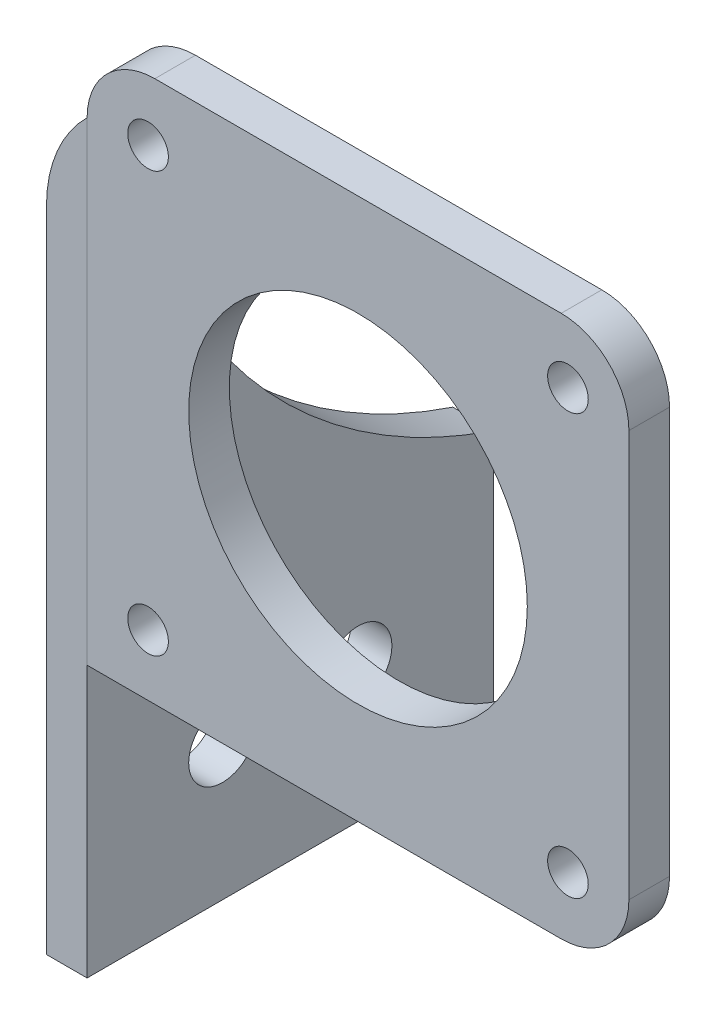
ISO-10303-21;
HEADER;
FILE_DESCRIPTION(('STEP AP214'),'2;1');
FILE_NAME('part.step','',(''),(''),'','','');
FILE_SCHEMA(('AUTOMOTIVE_DESIGN { 1 0 10303 214 1 1 1 1 }'));
ENDSEC;
DATA;
#1=APPLICATION_CONTEXT('core data for automotive mechanical design processes');
#2=APPLICATION_PROTOCOL_DEFINITION('international standard','automotive_design',2000,#1);
#3=PRODUCT_CONTEXT('',#1,'mechanical');
#4=PRODUCT('Part','Part','',(#3));
#5=PRODUCT_RELATED_PRODUCT_CATEGORY('part','',(#4));
#6=PRODUCT_DEFINITION_FORMATION('','',#4);
#7=PRODUCT_DEFINITION_CONTEXT('part definition',#1,'design');
#8=PRODUCT_DEFINITION('design','',#6,#7);
#9=PRODUCT_DEFINITION_SHAPE('','',#8);
#10=(LENGTH_UNIT() NAMED_UNIT(*) SI_UNIT(.MILLI.,.METRE.));
#11=(NAMED_UNIT(*) PLANE_ANGLE_UNIT() SI_UNIT($,.RADIAN.));
#12=(NAMED_UNIT(*) SI_UNIT($,.STERADIAN.) SOLID_ANGLE_UNIT());
#13=UNCERTAINTY_MEASURE_WITH_UNIT(LENGTH_MEASURE(1.E-05),#10,'distance_accuracy_value','');
#14=(GEOMETRIC_REPRESENTATION_CONTEXT(3) GLOBAL_UNCERTAINTY_ASSIGNED_CONTEXT((#13)) GLOBAL_UNIT_ASSIGNED_CONTEXT((#10,
#11,#12)) REPRESENTATION_CONTEXT('',''));
#15=CARTESIAN_POINT('',(0.,0.,0.));
#16=DIRECTION('',(0.,0.,1.));
#17=DIRECTION('',(1.,0.,0.));
#18=AXIS2_PLACEMENT_3D('',#15,#16,#17);
#19=CARTESIAN_POINT('',(-23.,17.5825832864055,-39.5329783342293));
#20=DIRECTION('',(1.,0.,0.));
#21=DIRECTION('',(0.,0.,-1.));
#22=AXIS2_PLACEMENT_3D('',#19,#20,#21);
#23=PLANE('',#22);
#24=DIRECTION('',(0.,1.,0.));
#25=VECTOR('',#24,1.);
#26=CARTESIAN_POINT('',(-23.,-40.,3.));
#27=LINE('',#26,#25);
#28=CARTESIAN_POINT('',(-23.,-40.,3.));
#29=VERTEX_POINT('',#28);
#30=CARTESIAN_POINT('',(-23.,7.85857157145712,3.));
#31=VERTEX_POINT('',#30);
#32=EDGE_CURVE('E108',#29,#31,#27,.T.);
#33=ORIENTED_EDGE('',*,*,#32,.T.);
#34=DIRECTION('',(0.,0.,1.));
#35=VECTOR('',#34,1.);
#36=CARTESIAN_POINT('',(-23.,7.85857157145712,-39.5329783342293));
#37=LINE('',#36,#35);
#38=CARTESIAN_POINT('',(-23.,7.85857157145712,-1.12764395769495));
#39=VERTEX_POINT('',#38);
#40=EDGE_CURVE('E106',#31,#39,#37,.F.);
#41=ORIENTED_EDGE('',*,*,#40,.T.);
#42=CARTESIAN_POINT('',(-23.,17.5825832864055,-39.5329783342293));
#43=DIRECTION('',(1.,0.,0.));
#44=DIRECTION('',(0.,0.,-1.));
#45=AXIS2_PLACEMENT_3D('',#42,#43,#44);
#46=CIRCLE('',#45,39.6172451390283);
#47=CARTESIAN_POINT('',(-23.,-20.,-27.));
#48=VERTEX_POINT('',#47);
#49=EDGE_CURVE('E100',#39,#48,#46,.T.);
#50=ORIENTED_EDGE('',*,*,#49,.T.);
#51=DIRECTION('',(0.,-1.,0.));
#52=VECTOR('',#51,1.);
#53=CARTESIAN_POINT('',(-23.,-40.,-27.));
#54=LINE('',#53,#52);
#55=CARTESIAN_POINT('',(-23.,-40.,-27.));
#56=VERTEX_POINT('',#55);
#57=EDGE_CURVE('E104',#48,#56,#54,.T.);
#58=ORIENTED_EDGE('',*,*,#57,.T.);
#59=DIRECTION('',(0.,0.,1.));
#60=VECTOR('',#59,1.);
#61=CARTESIAN_POINT('',(-23.,-40.,3.));
#62=LINE('',#61,#60);
#63=EDGE_CURVE('E122',#56,#29,#62,.T.);
#64=ORIENTED_EDGE('',*,*,#63,.T.);
#65=EDGE_LOOP('',(#33,#41,#50,#58,#64));
#66=FACE_BOUND('',#65,.T.);
#67=CARTESIAN_POINT('',(-23.,-30.,-17.));
#68=DIRECTION('',(-1.,0.,0.));
#69=DIRECTION('',(0.,0.,1.));
#70=AXIS2_PLACEMENT_3D('',#67,#68,#69);
#71=CIRCLE('',#70,2.5);
#72=CARTESIAN_POINT('',(-23.,-30.,-14.5));
#73=VERTEX_POINT('',#72);
#74=EDGE_CURVE('E131',#73,#73,#71,.T.);
#75=ORIENTED_EDGE('',*,*,#74,.F.);
#76=EDGE_LOOP('',(#75));
#77=FACE_BOUND('',#76,.T.);
#78=CARTESIAN_POINT('',(-23.,-30.,-6.99999999999999));
#79=DIRECTION('',(-1.,0.,0.));
#80=DIRECTION('',(0.,0.,1.));
#81=AXIS2_PLACEMENT_3D('',#78,#79,#80);
#82=CIRCLE('',#81,2.5);
#83=CARTESIAN_POINT('',(-23.,-30.,-4.49999999999999));
#84=VERTEX_POINT('',#83);
#85=EDGE_CURVE('E189',#84,#84,#82,.T.);
#86=ORIENTED_EDGE('',*,*,#85,.F.);
#87=EDGE_LOOP('',(#86));
#88=FACE_BOUND('',#87,.T.);
#89=ADVANCED_FACE('F53',(#66,#77,#88),#23,.F.);
#90=CARTESIAN_POINT('',(-20.,17.5825832864055,-39.5329783342293));
#91=DIRECTION('',(1.,0.,0.));
#92=DIRECTION('',(0.,0.,-1.));
#93=AXIS2_PLACEMENT_3D('',#90,#91,#92);
#94=PLANE('',#93);
#95=CARTESIAN_POINT('',(-20.,-30.,-17.));
#96=DIRECTION('',(-1.,0.,0.));
#97=DIRECTION('',(0.,0.,1.));
#98=AXIS2_PLACEMENT_3D('',#95,#96,#97);
#99=CIRCLE('',#98,2.5);
#100=CARTESIAN_POINT('',(-20.,-30.,-14.5));
#101=VERTEX_POINT('',#100);
#102=EDGE_CURVE('E194',#101,#101,#99,.T.);
#103=ORIENTED_EDGE('',*,*,#102,.T.);
#104=EDGE_LOOP('',(#103));
#105=FACE_BOUND('',#104,.T.);
#106=DIRECTION('',(0.,1.,0.));
#107=VECTOR('',#106,1.);
#108=CARTESIAN_POINT('',(-20.,-40.,3.));
#109=LINE('',#108,#107);
#110=CARTESIAN_POINT('',(-20.,-40.,3.));
#111=VERTEX_POINT('',#110);
#112=CARTESIAN_POINT('',(-20.,15.,3.));
#113=VERTEX_POINT('',#112);
#114=EDGE_CURVE('E128',#111,#113,#109,.T.);
#115=ORIENTED_EDGE('',*,*,#114,.F.);
#116=DIRECTION('',(0.,0.,1.));
#117=VECTOR('',#116,1.);
#118=CARTESIAN_POINT('',(-20.,-40.,3.));
#119=LINE('',#118,#117);
#120=CARTESIAN_POINT('',(-20.,-40.,-27.));
#121=VERTEX_POINT('',#120);
#122=EDGE_CURVE('E136',#121,#111,#119,.T.);
#123=ORIENTED_EDGE('',*,*,#122,.F.);
#124=DIRECTION('',(0.,-1.,0.));
#125=VECTOR('',#124,1.);
#126=CARTESIAN_POINT('',(-20.,-40.,-27.));
#127=LINE('',#126,#125);
#128=CARTESIAN_POINT('',(-20.,-20.,-27.));
#129=VERTEX_POINT('',#128);
#130=EDGE_CURVE('E134',#129,#121,#127,.T.);
#131=ORIENTED_EDGE('',*,*,#130,.F.);
#132=CARTESIAN_POINT('',(-20.,17.5825832864055,-39.5329783342293));
#133=DIRECTION('',(1.,0.,0.));
#134=DIRECTION('',(0.,0.,-1.));
#135=AXIS2_PLACEMENT_3D('',#132,#133,#134);
#136=CIRCLE('',#135,39.6172451390283);
#137=CARTESIAN_POINT('',(-20.,15.,0.));
#138=VERTEX_POINT('',#137);
#139=EDGE_CURVE('E114',#138,#129,#136,.T.);
#140=ORIENTED_EDGE('',*,*,#139,.F.);
#141=DIRECTION('',(0.,0.,-1.));
#142=VECTOR('',#141,1.);
#143=CARTESIAN_POINT('',(-20.,15.,3.));
#144=LINE('',#143,#142);
#145=EDGE_CURVE('E130',#113,#138,#144,.T.);
#146=ORIENTED_EDGE('',*,*,#145,.F.);
#147=EDGE_LOOP('',(#115,#123,#131,#140,#146));
#148=FACE_BOUND('',#147,.T.);
#149=CARTESIAN_POINT('',(-20.,-30.,-6.99999999999999));
#150=DIRECTION('',(-1.,0.,0.));
#151=DIRECTION('',(0.,0.,1.));
#152=AXIS2_PLACEMENT_3D('',#149,#150,#151);
#153=CIRCLE('',#152,2.5);
#154=CARTESIAN_POINT('',(-20.,-30.,-4.49999999999999));
#155=VERTEX_POINT('',#154);
#156=EDGE_CURVE('E192',#155,#155,#153,.T.);
#157=ORIENTED_EDGE('',*,*,#156,.T.);
#158=EDGE_LOOP('',(#157));
#159=FACE_BOUND('',#158,.T.);
#160=ADVANCED_FACE('F152',(#105,#148,#159),#94,.T.);
#161=CARTESIAN_POINT('',(-23.,-40.,3.));
#162=DIRECTION('',(0.,0.,-1.));
#163=DIRECTION('',(0.,1.,0.));
#164=AXIS2_PLACEMENT_3D('',#161,#162,#163);
#165=PLANE('',#164);
#166=ORIENTED_EDGE('',*,*,#114,.T.);
#167=CARTESIAN_POINT('',(-13.,7.85857157145712,3.));
#168=DIRECTION('',(0.,0.,-1.));
#169=DIRECTION('',(0.,1.,0.));
#170=AXIS2_PLACEMENT_3D('',#167,#168,#169);
#171=CIRCLE('',#170,10.);
#172=EDGE_CURVE('E12',#113,#31,#171,.F.);
#173=ORIENTED_EDGE('',*,*,#172,.T.);
#174=ORIENTED_EDGE('',*,*,#32,.F.);
#175=DIRECTION('',(1.,0.,0.));
#176=VECTOR('',#175,1.);
#177=CARTESIAN_POINT('',(-23.,-40.,3.));
#178=LINE('',#177,#176);
#179=EDGE_CURVE('E124',#29,#111,#178,.T.);
#180=ORIENTED_EDGE('',*,*,#179,.T.);
#181=EDGE_LOOP('',(#166,#173,#174,#180));
#182=FACE_BOUND('',#181,.T.);
#183=ADVANCED_FACE('F149',(#182),#165,.F.);
#184=CARTESIAN_POINT('',(-23.,17.5825832864055,-39.5329783342293));
#185=DIRECTION('',(1.,0.,0.));
#186=DIRECTION('',(0.,0.,-1.));
#187=AXIS2_PLACEMENT_3D('',#184,#185,#186);
#188=CYLINDRICAL_SURFACE('',#187,39.6172451390283);
#189=ORIENTED_EDGE('',*,*,#49,.F.);
#190=CARTESIAN_POINT('',(-23.,7.85857157145712,-1.12764395769495));
#191=CARTESIAN_POINT('',(-23.0000319209758,8.12974956813189,-1.05895427773539));
#192=CARTESIAN_POINT('',(-22.9889700171909,8.40169050032335,-0.993184804813319));
#193=CARTESIAN_POINT('',(-22.9445171590816,8.94520383395614,-0.867761509036204));
#194=CARTESIAN_POINT('',(-22.9111223388912,9.21677616343493,-0.808108747056511));
#195=CARTESIAN_POINT('',(-22.8218310980394,9.7577507066422,-0.695178834425145));
#196=CARTESIAN_POINT('',(-22.7659190428252,10.0271512795944,-0.641906147108968));
#197=CARTESIAN_POINT('',(-22.6317134091241,10.5615270693367,-0.541893125100899));
#198=CARTESIAN_POINT('',(-22.5534222065767,10.8265027527474,-0.495152097742489));
#199=CARTESIAN_POINT('',(-22.3746189301337,11.3504591926651,-0.408083338343636));
#200=CARTESIAN_POINT('',(-22.2740686600344,11.6094287885512,-0.367766837724825));
#201=CARTESIAN_POINT('',(-22.0513707296473,12.1188485546675,-0.293457738989226));
#202=CARTESIAN_POINT('',(-21.9292233051454,12.3692988178716,-0.259465071840601));
#203=CARTESIAN_POINT('',(-21.6643278968498,12.8592562248348,-0.197534085010089));
#204=CARTESIAN_POINT('',(-21.5216166224987,13.0987818881343,-0.169585194064152));
#205=CARTESIAN_POINT('',(-21.2164450536759,13.5653832857669,-0.11923377029903));
#206=CARTESIAN_POINT('',(-21.0539935658788,13.7924645067915,-0.0968287776351461));
#207=CARTESIAN_POINT('',(-20.7463366651438,14.1865283866731,-0.0611721575644502));
#208=CARTESIAN_POINT('',(-20.6046131819379,14.356159162547,-0.0469861095867625));
#209=CARTESIAN_POINT('',(-20.3103147016795,14.6855825169659,-0.0214508691222647));
#210=CARTESIAN_POINT('',(-20.1577531941874,14.845386879104,-0.0100982268334988));
#211=CARTESIAN_POINT('',(-20.,15.,0.));
#212=B_SPLINE_CURVE_WITH_KNOTS('',3,(#190,#191,#192,#193,#194,#195,#196,#197,#198,#199,#200,
#201,#202,#203,#204,#205,#206,#207,#208,#209,#210,#211),.UNSPECIFIED.,.F.,.F.,(4,2,2,2,2,2,2,2,
2,2,4),(0.,0.83902559096287,1.67819645629674,2.51795099648467,3.3576164150717,4.19873401163109,
5.03984242589621,5.87946752602923,6.71871941118413,7.38272818475243,8.04592450920289),.UNSPECIFIED.);
#213=EDGE_CURVE('E62',#39,#138,#212,.T.);
#214=ORIENTED_EDGE('',*,*,#213,.T.);
#215=ORIENTED_EDGE('',*,*,#139,.T.);
#216=DIRECTION('',(1.,0.,0.));
#217=VECTOR('',#216,1.);
#218=CARTESIAN_POINT('',(-23.,-20.,-27.));
#219=LINE('',#218,#217);
#220=EDGE_CURVE('E111',#48,#129,#219,.T.);
#221=ORIENTED_EDGE('',*,*,#220,.F.);
#222=EDGE_LOOP('',(#189,#214,#215,#221));
#223=FACE_BOUND('',#222,.T.);
#224=ADVANCED_FACE('F112',(#223),#188,.F.);
#225=CARTESIAN_POINT('',(-23.,-40.,-27.));
#226=DIRECTION('',(0.,0.,1.));
#227=DIRECTION('',(1.,0.,0.));
#228=AXIS2_PLACEMENT_3D('',#225,#226,#227);
#229=PLANE('',#228);
#230=ORIENTED_EDGE('',*,*,#130,.T.);
#231=DIRECTION('',(1.,0.,0.));
#232=VECTOR('',#231,1.);
#233=CARTESIAN_POINT('',(-23.,-40.,-27.));
#234=LINE('',#233,#232);
#235=EDGE_CURVE('E117',#56,#121,#234,.T.);
#236=ORIENTED_EDGE('',*,*,#235,.F.);
#237=ORIENTED_EDGE('',*,*,#57,.F.);
#238=ORIENTED_EDGE('',*,*,#220,.T.);
#239=EDGE_LOOP('',(#230,#236,#237,#238));
#240=FACE_BOUND('',#239,.T.);
#241=ADVANCED_FACE('F119',(#240),#229,.F.);
#242=CARTESIAN_POINT('',(-23.,-40.,3.));
#243=DIRECTION('',(0.,1.,0.));
#244=DIRECTION('',(0.,0.,1.));
#245=AXIS2_PLACEMENT_3D('',#242,#243,#244);
#246=PLANE('',#245);
#247=ORIENTED_EDGE('',*,*,#122,.T.);
#248=ORIENTED_EDGE('',*,*,#179,.F.);
#249=ORIENTED_EDGE('',*,*,#63,.F.);
#250=ORIENTED_EDGE('',*,*,#235,.T.);
#251=EDGE_LOOP('',(#247,#248,#249,#250));
#252=FACE_BOUND('',#251,.T.);
#253=ADVANCED_FACE('F166',(#252),#246,.F.);
#254=CARTESIAN_POINT('',(-23.,-30.,-17.));
#255=DIRECTION('',(1.,0.,0.));
#256=DIRECTION('',(0.,0.,-1.));
#257=AXIS2_PLACEMENT_3D('',#254,#255,#256);
#258=CYLINDRICAL_SURFACE('',#257,2.5);
#259=ORIENTED_EDGE('',*,*,#74,.T.);
#260=EDGE_LOOP('',(#259));
#261=FACE_BOUND('',#260,.T.);
#262=ORIENTED_EDGE('',*,*,#102,.F.);
#263=EDGE_LOOP('',(#262));
#264=FACE_BOUND('',#263,.T.);
#265=ADVANCED_FACE('F164',(#261,#264),#258,.F.);
#266=CARTESIAN_POINT('',(-23.,-30.,-6.99999999999999));
#267=DIRECTION('',(1.,0.,0.));
#268=DIRECTION('',(0.,0.,-1.));
#269=AXIS2_PLACEMENT_3D('',#266,#267,#268);
#270=CYLINDRICAL_SURFACE('',#269,2.5);
#271=ORIENTED_EDGE('',*,*,#85,.T.);
#272=EDGE_LOOP('',(#271));
#273=FACE_BOUND('',#272,.T.);
#274=ORIENTED_EDGE('',*,*,#156,.F.);
#275=EDGE_LOOP('',(#274));
#276=FACE_BOUND('',#275,.T.);
#277=ADVANCED_FACE('F173',(#273,#276),#270,.F.);
#278=CARTESIAN_POINT('',(-13.,7.85857157145712,3.));
#279=DIRECTION('',(0.,0.,1.));
#280=DIRECTION('',(1.,0.,0.));
#281=AXIS2_PLACEMENT_3D('',#278,#279,#280);
#282=CYLINDRICAL_SURFACE('',#281,10.);
#283=ORIENTED_EDGE('',*,*,#172,.F.);
#284=ORIENTED_EDGE('',*,*,#145,.T.);
#285=ORIENTED_EDGE('',*,*,#213,.F.);
#286=ORIENTED_EDGE('',*,*,#40,.F.);
#287=EDGE_LOOP('',(#283,#284,#285,#286));
#288=FACE_BOUND('',#287,.T.);
#289=ADVANCED_FACE('F55',(#288),#282,.T.);
#290=CLOSED_SHELL('',(#89,#160,#183,#224,#241,#253,#265,#277,#289));
#291=MANIFOLD_SOLID_BREP('B2',#290);
#292=CARTESIAN_POINT('',(15.,-15.,3.));
#293=DIRECTION('',(0.,0.,1.));
#294=DIRECTION('',(1.,0.,0.));
#295=AXIS2_PLACEMENT_3D('',#292,#293,#294);
#296=PLANE('',#295);
#297=CARTESIAN_POINT('',(-15.5,-15.5,3.));
#298=DIRECTION('',(0.,0.,1.));
#299=DIRECTION('',(1.,0.,0.));
#300=AXIS2_PLACEMENT_3D('',#297,#298,#299);
#301=CIRCLE('',#300,1.5);
#302=CARTESIAN_POINT('',(-14.,-15.5,3.));
#303=VERTEX_POINT('',#302);
#304=EDGE_CURVE('E395',#303,#303,#301,.T.);
#305=ORIENTED_EDGE('',*,*,#304,.F.);
#306=EDGE_LOOP('',(#305));
#307=FACE_BOUND('',#306,.T.);
#308=CARTESIAN_POINT('',(-15.5,15.5,3.));
#309=DIRECTION('',(0.,0.,1.));
#310=DIRECTION('',(1.,0.,0.));
#311=AXIS2_PLACEMENT_3D('',#308,#309,#310);
#312=CIRCLE('',#311,1.5);
#313=CARTESIAN_POINT('',(-14.,15.5,3.));
#314=VERTEX_POINT('',#313);
#315=EDGE_CURVE('E383',#314,#314,#312,.T.);
#316=ORIENTED_EDGE('',*,*,#315,.F.);
#317=EDGE_LOOP('',(#316));
#318=FACE_BOUND('',#317,.T.);
#319=DIRECTION('',(1.,0.,0.));
#320=VECTOR('',#319,1.);
#321=CARTESIAN_POINT('',(-20.,-20.,3.));
#322=LINE('',#321,#320);
#323=CARTESIAN_POINT('',(-20.,-20.,3.));
#324=VERTEX_POINT('',#323);
#325=CARTESIAN_POINT('',(15.,-20.,3.));
#326=VERTEX_POINT('',#325);
#327=EDGE_CURVE('E303',#324,#326,#322,.T.);
#328=ORIENTED_EDGE('',*,*,#327,.T.);
#329=CARTESIAN_POINT('',(15.,-15.,3.));
#330=DIRECTION('',(0.,0.,1.));
#331=DIRECTION('',(1.,0.,0.));
#332=AXIS2_PLACEMENT_3D('',#329,#330,#331);
#333=CIRCLE('',#332,5.);
#334=CARTESIAN_POINT('',(20.,-15.,3.));
#335=VERTEX_POINT('',#334);
#336=EDGE_CURVE('E375',#326,#335,#333,.T.);
#337=ORIENTED_EDGE('',*,*,#336,.T.);
#338=DIRECTION('',(0.,1.,0.));
#339=VECTOR('',#338,1.);
#340=CARTESIAN_POINT('',(20.,-15.,3.));
#341=LINE('',#340,#339);
#342=CARTESIAN_POINT('',(20.,15.,3.));
#343=VERTEX_POINT('',#342);
#344=EDGE_CURVE('E367',#335,#343,#341,.T.);
#345=ORIENTED_EDGE('',*,*,#344,.T.);
#346=CARTESIAN_POINT('',(15.,15.,3.));
#347=DIRECTION('',(0.,0.,1.));
#348=DIRECTION('',(-1.,0.,0.));
#349=AXIS2_PLACEMENT_3D('',#346,#347,#348);
#350=CIRCLE('',#349,5.);
#351=CARTESIAN_POINT('',(15.,20.,3.));
#352=VERTEX_POINT('',#351);
#353=EDGE_CURVE('E321',#343,#352,#350,.T.);
#354=ORIENTED_EDGE('',*,*,#353,.T.);
#355=DIRECTION('',(-1.,0.,0.));
#356=VECTOR('',#355,1.);
#357=CARTESIAN_POINT('',(-15.,20.,3.));
#358=LINE('',#357,#356);
#359=CARTESIAN_POINT('',(-15.,20.,3.));
#360=VERTEX_POINT('',#359);
#361=EDGE_CURVE('E314',#352,#360,#358,.T.);
#362=ORIENTED_EDGE('',*,*,#361,.T.);
#363=CARTESIAN_POINT('',(-15.,15.,3.));
#364=DIRECTION('',(0.,0.,1.));
#365=DIRECTION('',(-1.,0.,0.));
#366=AXIS2_PLACEMENT_3D('',#363,#364,#365);
#367=CIRCLE('',#366,5.);
#368=CARTESIAN_POINT('',(-20.,15.,3.));
#369=VERTEX_POINT('',#368);
#370=EDGE_CURVE('E318',#360,#369,#367,.T.);
#371=ORIENTED_EDGE('',*,*,#370,.T.);
#372=DIRECTION('',(0.,-1.,0.));
#373=VECTOR('',#372,1.);
#374=CARTESIAN_POINT('',(-20.,-15.,3.));
#375=LINE('',#374,#373);
#376=EDGE_CURVE('E268',#369,#324,#375,.T.);
#377=ORIENTED_EDGE('',*,*,#376,.T.);
#378=EDGE_LOOP('',(#328,#337,#345,#354,#362,#371,#377));
#379=FACE_BOUND('',#378,.T.);
#380=CARTESIAN_POINT('',(0.,0.,3.));
#381=DIRECTION('',(0.,0.,1.));
#382=DIRECTION('',(1.,0.,0.));
#383=AXIS2_PLACEMENT_3D('',#380,#381,#382);
#384=CIRCLE('',#383,12.5);
#385=CARTESIAN_POINT('',(12.5,0.,3.));
#386=VERTEX_POINT('',#385);
#387=EDGE_CURVE('E344',#386,#386,#384,.T.);
#388=ORIENTED_EDGE('',*,*,#387,.F.);
#389=EDGE_LOOP('',(#388));
#390=FACE_BOUND('',#389,.T.);
#391=CARTESIAN_POINT('',(15.5,15.5,3.));
#392=DIRECTION('',(0.,0.,1.));
#393=DIRECTION('',(1.,0.,0.));
#394=AXIS2_PLACEMENT_3D('',#391,#392,#393);
#395=CIRCLE('',#394,1.50000000000003);
#396=CARTESIAN_POINT('',(17.,15.5,3.));
#397=VERTEX_POINT('',#396);
#398=EDGE_CURVE('E389',#397,#397,#395,.T.);
#399=ORIENTED_EDGE('',*,*,#398,.F.);
#400=EDGE_LOOP('',(#399));
#401=FACE_BOUND('',#400,.T.);
#402=CARTESIAN_POINT('',(15.5,-15.5,3.));
#403=DIRECTION('',(0.,0.,1.));
#404=DIRECTION('',(1.,0.,0.));
#405=AXIS2_PLACEMENT_3D('',#402,#403,#404);
#406=CIRCLE('',#405,1.5);
#407=CARTESIAN_POINT('',(17.,-15.5,3.));
#408=VERTEX_POINT('',#407);
#409=EDGE_CURVE('E401',#408,#408,#406,.T.);
#410=ORIENTED_EDGE('',*,*,#409,.F.);
#411=EDGE_LOOP('',(#410));
#412=FACE_BOUND('',#411,.T.);
#413=ADVANCED_FACE('F251',(#307,#318,#379,#390,#401,#412),#296,.T.);
#414=CARTESIAN_POINT('',(15.,-15.,0.));
#415=DIRECTION('',(0.,0.,1.));
#416=DIRECTION('',(1.,0.,0.));
#417=AXIS2_PLACEMENT_3D('',#414,#415,#416);
#418=PLANE('',#417);
#419=DIRECTION('',(1.,0.,0.));
#420=VECTOR('',#419,1.);
#421=CARTESIAN_POINT('',(-15.,-20.,0.));
#422=LINE('',#421,#420);
#423=CARTESIAN_POINT('',(-20.,-20.,0.));
#424=VERTEX_POINT('',#423);
#425=CARTESIAN_POINT('',(15.,-20.,0.));
#426=VERTEX_POINT('',#425);
#427=EDGE_CURVE('E298',#424,#426,#422,.T.);
#428=ORIENTED_EDGE('',*,*,#427,.F.);
#429=DIRECTION('',(0.,-1.,0.));
#430=VECTOR('',#429,1.);
#431=CARTESIAN_POINT('',(-20.,-15.,0.));
#432=LINE('',#431,#430);
#433=CARTESIAN_POINT('',(-20.,15.,0.));
#434=VERTEX_POINT('',#433);
#435=EDGE_CURVE('E294',#434,#424,#432,.T.);
#436=ORIENTED_EDGE('',*,*,#435,.F.);
#437=CARTESIAN_POINT('',(-15.,15.,0.));
#438=DIRECTION('',(0.,0.,1.));
#439=DIRECTION('',(-1.,0.,0.));
#440=AXIS2_PLACEMENT_3D('',#437,#438,#439);
#441=CIRCLE('',#440,5.);
#442=CARTESIAN_POINT('',(-15.,20.,0.));
#443=VERTEX_POINT('',#442);
#444=EDGE_CURVE('E351',#443,#434,#441,.T.);
#445=ORIENTED_EDGE('',*,*,#444,.F.);
#446=DIRECTION('',(-1.,0.,0.));
#447=VECTOR('',#446,1.);
#448=CARTESIAN_POINT('',(-15.,20.,0.));
#449=LINE('',#448,#447);
#450=CARTESIAN_POINT('',(15.,20.,0.));
#451=VERTEX_POINT('',#450);
#452=EDGE_CURVE('E330',#451,#443,#449,.T.);
#453=ORIENTED_EDGE('',*,*,#452,.F.);
#454=CARTESIAN_POINT('',(15.,15.,0.));
#455=DIRECTION('',(0.,0.,1.));
#456=DIRECTION('',(-1.,0.,0.));
#457=AXIS2_PLACEMENT_3D('',#454,#455,#456);
#458=CIRCLE('',#457,5.);
#459=CARTESIAN_POINT('',(20.,15.,0.));
#460=VERTEX_POINT('',#459);
#461=EDGE_CURVE('E348',#460,#451,#458,.T.);
#462=ORIENTED_EDGE('',*,*,#461,.F.);
#463=DIRECTION('',(0.,1.,0.));
#464=VECTOR('',#463,1.);
#465=CARTESIAN_POINT('',(20.,-15.,0.));
#466=LINE('',#465,#464);
#467=CARTESIAN_POINT('',(20.,-15.,0.));
#468=VERTEX_POINT('',#467);
#469=EDGE_CURVE('E346',#468,#460,#466,.T.);
#470=ORIENTED_EDGE('',*,*,#469,.F.);
#471=CARTESIAN_POINT('',(15.,-15.,0.));
#472=DIRECTION('',(0.,0.,1.));
#473=DIRECTION('',(1.,0.,0.));
#474=AXIS2_PLACEMENT_3D('',#471,#472,#473);
#475=CIRCLE('',#474,5.);
#476=EDGE_CURVE('E343',#426,#468,#475,.T.);
#477=ORIENTED_EDGE('',*,*,#476,.F.);
#478=EDGE_LOOP('',(#428,#436,#445,#453,#462,#470,#477));
#479=FACE_BOUND('',#478,.T.);
#480=CARTESIAN_POINT('',(0.,0.,0.));
#481=DIRECTION('',(0.,0.,1.));
#482=DIRECTION('',(1.,0.,0.));
#483=AXIS2_PLACEMENT_3D('',#480,#481,#482);
#484=CIRCLE('',#483,12.5);
#485=CARTESIAN_POINT('',(12.5,0.,0.));
#486=VERTEX_POINT('',#485);
#487=EDGE_CURVE('E380',#486,#486,#484,.T.);
#488=ORIENTED_EDGE('',*,*,#487,.T.);
#489=EDGE_LOOP('',(#488));
#490=FACE_BOUND('',#489,.T.);
#491=CARTESIAN_POINT('',(-15.5,15.5,0.));
#492=DIRECTION('',(0.,0.,1.));
#493=DIRECTION('',(1.,0.,0.));
#494=AXIS2_PLACEMENT_3D('',#491,#492,#493);
#495=CIRCLE('',#494,1.5);
#496=CARTESIAN_POINT('',(-14.,15.5,0.));
#497=VERTEX_POINT('',#496);
#498=EDGE_CURVE('E386',#497,#497,#495,.T.);
#499=ORIENTED_EDGE('',*,*,#498,.T.);
#500=EDGE_LOOP('',(#499));
#501=FACE_BOUND('',#500,.T.);
#502=CARTESIAN_POINT('',(15.5,15.5,0.));
#503=DIRECTION('',(0.,0.,1.));
#504=DIRECTION('',(1.,0.,0.));
#505=AXIS2_PLACEMENT_3D('',#502,#503,#504);
#506=CIRCLE('',#505,1.50000000000003);
#507=CARTESIAN_POINT('',(17.,15.5,0.));
#508=VERTEX_POINT('',#507);
#509=EDGE_CURVE('E392',#508,#508,#506,.T.);
#510=ORIENTED_EDGE('',*,*,#509,.T.);
#511=EDGE_LOOP('',(#510));
#512=FACE_BOUND('',#511,.T.);
#513=CARTESIAN_POINT('',(-15.5,-15.5,0.));
#514=DIRECTION('',(0.,0.,1.));
#515=DIRECTION('',(1.,0.,0.));
#516=AXIS2_PLACEMENT_3D('',#513,#514,#515);
#517=CIRCLE('',#516,1.5);
#518=CARTESIAN_POINT('',(-14.,-15.5,0.));
#519=VERTEX_POINT('',#518);
#520=EDGE_CURVE('E398',#519,#519,#517,.T.);
#521=ORIENTED_EDGE('',*,*,#520,.T.);
#522=EDGE_LOOP('',(#521));
#523=FACE_BOUND('',#522,.T.);
#524=CARTESIAN_POINT('',(15.5,-15.5,0.));
#525=DIRECTION('',(0.,0.,1.));
#526=DIRECTION('',(1.,0.,0.));
#527=AXIS2_PLACEMENT_3D('',#524,#525,#526);
#528=CIRCLE('',#527,1.5);
#529=CARTESIAN_POINT('',(17.,-15.5,0.));
#530=VERTEX_POINT('',#529);
#531=EDGE_CURVE('E404',#530,#530,#528,.T.);
#532=ORIENTED_EDGE('',*,*,#531,.T.);
#533=EDGE_LOOP('',(#532));
#534=FACE_BOUND('',#533,.T.);
#535=ADVANCED_FACE('F371',(#479,#490,#501,#512,#523,#534),#418,.F.);
#536=CARTESIAN_POINT('',(-15.,-20.,3.));
#537=DIRECTION('',(0.,1.,0.));
#538=DIRECTION('',(0.,0.,1.));
#539=AXIS2_PLACEMENT_3D('',#536,#537,#538);
#540=PLANE('',#539);
#541=ORIENTED_EDGE('',*,*,#427,.T.);
#542=DIRECTION('',(0.,0.,-1.));
#543=VECTOR('',#542,1.);
#544=CARTESIAN_POINT('',(15.,-20.,3.));
#545=LINE('',#544,#543);
#546=EDGE_CURVE('E51',#326,#426,#545,.T.);
#547=ORIENTED_EDGE('',*,*,#546,.F.);
#548=ORIENTED_EDGE('',*,*,#327,.F.);
#549=DIRECTION('',(0.,0.,-1.));
#550=VECTOR('',#549,1.);
#551=CARTESIAN_POINT('',(-20.,-20.,3.));
#552=LINE('',#551,#550);
#553=EDGE_CURVE('E338',#324,#424,#552,.T.);
#554=ORIENTED_EDGE('',*,*,#553,.T.);
#555=EDGE_LOOP('',(#541,#547,#548,#554));
#556=FACE_BOUND('',#555,.T.);
#557=ADVANCED_FACE('F253',(#556),#540,.F.);
#558=CARTESIAN_POINT('',(15.,-15.,3.));
#559=DIRECTION('',(0.,0.,-1.));
#560=DIRECTION('',(-1.,0.,0.));
#561=AXIS2_PLACEMENT_3D('',#558,#559,#560);
#562=CYLINDRICAL_SURFACE('',#561,5.);
#563=ORIENTED_EDGE('',*,*,#476,.T.);
#564=DIRECTION('',(0.,0.,-1.));
#565=VECTOR('',#564,1.);
#566=CARTESIAN_POINT('',(20.,-15.,3.));
#567=LINE('',#566,#565);
#568=EDGE_CURVE('E260',#335,#468,#567,.T.);
#569=ORIENTED_EDGE('',*,*,#568,.F.);
#570=ORIENTED_EDGE('',*,*,#336,.F.);
#571=ORIENTED_EDGE('',*,*,#546,.T.);
#572=EDGE_LOOP('',(#563,#569,#570,#571));
#573=FACE_BOUND('',#572,.T.);
#574=ADVANCED_FACE('F437',(#573),#562,.T.);
#575=CARTESIAN_POINT('',(20.,-15.,3.));
#576=DIRECTION('',(-1.,0.,0.));
#577=DIRECTION('',(0.,0.,1.));
#578=AXIS2_PLACEMENT_3D('',#575,#576,#577);
#579=PLANE('',#578);
#580=ORIENTED_EDGE('',*,*,#469,.T.);
#581=DIRECTION('',(0.,0.,-1.));
#582=VECTOR('',#581,1.);
#583=CARTESIAN_POINT('',(20.,15.,3.));
#584=LINE('',#583,#582);
#585=EDGE_CURVE('E358',#343,#460,#584,.T.);
#586=ORIENTED_EDGE('',*,*,#585,.F.);
#587=ORIENTED_EDGE('',*,*,#344,.F.);
#588=ORIENTED_EDGE('',*,*,#568,.T.);
#589=EDGE_LOOP('',(#580,#586,#587,#588));
#590=FACE_BOUND('',#589,.T.);
#591=ADVANCED_FACE('F365',(#590),#579,.F.);
#592=CARTESIAN_POINT('',(15.,15.,3.));
#593=DIRECTION('',(0.,0.,-1.));
#594=DIRECTION('',(-1.,0.,0.));
#595=AXIS2_PLACEMENT_3D('',#592,#593,#594);
#596=CYLINDRICAL_SURFACE('',#595,5.);
#597=ORIENTED_EDGE('',*,*,#461,.T.);
#598=DIRECTION('',(0.,0.,-1.));
#599=VECTOR('',#598,1.);
#600=CARTESIAN_POINT('',(15.,20.,3.));
#601=LINE('',#600,#599);
#602=EDGE_CURVE('E332',#352,#451,#601,.T.);
#603=ORIENTED_EDGE('',*,*,#602,.F.);
#604=ORIENTED_EDGE('',*,*,#353,.F.);
#605=ORIENTED_EDGE('',*,*,#585,.T.);
#606=EDGE_LOOP('',(#597,#603,#604,#605));
#607=FACE_BOUND('',#606,.T.);
#608=ADVANCED_FACE('F374',(#607),#596,.T.);
#609=CARTESIAN_POINT('',(-15.,20.,3.));
#610=DIRECTION('',(0.,-1.,0.));
#611=DIRECTION('',(0.,0.,-1.));
#612=AXIS2_PLACEMENT_3D('',#609,#610,#611);
#613=PLANE('',#612);
#614=ORIENTED_EDGE('',*,*,#452,.T.);
#615=DIRECTION('',(0.,0.,-1.));
#616=VECTOR('',#615,1.);
#617=CARTESIAN_POINT('',(-15.,20.,3.));
#618=LINE('',#617,#616);
#619=EDGE_CURVE('E327',#360,#443,#618,.T.);
#620=ORIENTED_EDGE('',*,*,#619,.F.);
#621=ORIENTED_EDGE('',*,*,#361,.F.);
#622=ORIENTED_EDGE('',*,*,#602,.T.);
#623=EDGE_LOOP('',(#614,#620,#621,#622));
#624=FACE_BOUND('',#623,.T.);
#625=ADVANCED_FACE('F328',(#624),#613,.F.);
#626=CARTESIAN_POINT('',(-15.,15.,3.));
#627=DIRECTION('',(0.,0.,-1.));
#628=DIRECTION('',(-1.,0.,0.));
#629=AXIS2_PLACEMENT_3D('',#626,#627,#628);
#630=CYLINDRICAL_SURFACE('',#629,5.);
#631=ORIENTED_EDGE('',*,*,#444,.T.);
#632=DIRECTION('',(0.,0.,-1.));
#633=VECTOR('',#632,1.);
#634=CARTESIAN_POINT('',(-20.,15.,3.));
#635=LINE('',#634,#633);
#636=EDGE_CURVE('E333',#369,#434,#635,.T.);
#637=ORIENTED_EDGE('',*,*,#636,.F.);
#638=ORIENTED_EDGE('',*,*,#370,.F.);
#639=ORIENTED_EDGE('',*,*,#619,.T.);
#640=EDGE_LOOP('',(#631,#637,#638,#639));
#641=FACE_BOUND('',#640,.T.);
#642=ADVANCED_FACE('F335',(#641),#630,.T.);
#643=CARTESIAN_POINT('',(-20.,-15.,3.));
#644=DIRECTION('',(1.,0.,0.));
#645=DIRECTION('',(0.,0.,-1.));
#646=AXIS2_PLACEMENT_3D('',#643,#644,#645);
#647=PLANE('',#646);
#648=ORIENTED_EDGE('',*,*,#435,.T.);
#649=ORIENTED_EDGE('',*,*,#553,.F.);
#650=ORIENTED_EDGE('',*,*,#376,.F.);
#651=ORIENTED_EDGE('',*,*,#636,.T.);
#652=EDGE_LOOP('',(#648,#649,#650,#651));
#653=FACE_BOUND('',#652,.T.);
#654=ADVANCED_FACE('F426',(#653),#647,.F.);
#655=CARTESIAN_POINT('',(0.,0.,3.));
#656=DIRECTION('',(0.,0.,-1.));
#657=DIRECTION('',(-1.,0.,0.));
#658=AXIS2_PLACEMENT_3D('',#655,#656,#657);
#659=CYLINDRICAL_SURFACE('',#658,12.5);
#660=ORIENTED_EDGE('',*,*,#387,.T.);
#661=EDGE_LOOP('',(#660));
#662=FACE_BOUND('',#661,.T.);
#663=ORIENTED_EDGE('',*,*,#487,.F.);
#664=EDGE_LOOP('',(#663));
#665=FACE_BOUND('',#664,.T.);
#666=ADVANCED_FACE('F423',(#662,#665),#659,.F.);
#667=CARTESIAN_POINT('',(-15.5,15.5,3.));
#668=DIRECTION('',(0.,0.,-1.));
#669=DIRECTION('',(-1.,0.,0.));
#670=AXIS2_PLACEMENT_3D('',#667,#668,#669);
#671=CYLINDRICAL_SURFACE('',#670,1.5);
#672=ORIENTED_EDGE('',*,*,#315,.T.);
#673=EDGE_LOOP('',(#672));
#674=FACE_BOUND('',#673,.T.);
#675=ORIENTED_EDGE('',*,*,#498,.F.);
#676=EDGE_LOOP('',(#675));
#677=FACE_BOUND('',#676,.T.);
#678=ADVANCED_FACE('F496',(#674,#677),#671,.F.);
#679=CARTESIAN_POINT('',(15.5,15.5,3.));
#680=DIRECTION('',(0.,0.,-1.));
#681=DIRECTION('',(-1.,0.,0.));
#682=AXIS2_PLACEMENT_3D('',#679,#680,#681);
#683=CYLINDRICAL_SURFACE('',#682,1.50000000000003);
#684=ORIENTED_EDGE('',*,*,#398,.T.);
#685=EDGE_LOOP('',(#684));
#686=FACE_BOUND('',#685,.T.);
#687=ORIENTED_EDGE('',*,*,#509,.F.);
#688=EDGE_LOOP('',(#687));
#689=FACE_BOUND('',#688,.T.);
#690=ADVANCED_FACE('F504',(#686,#689),#683,.F.);
#691=CARTESIAN_POINT('',(-15.5,-15.5,3.));
#692=DIRECTION('',(0.,0.,-1.));
#693=DIRECTION('',(-1.,0.,0.));
#694=AXIS2_PLACEMENT_3D('',#691,#692,#693);
#695=CYLINDRICAL_SURFACE('',#694,1.5);
#696=ORIENTED_EDGE('',*,*,#304,.T.);
#697=EDGE_LOOP('',(#696));
#698=FACE_BOUND('',#697,.T.);
#699=ORIENTED_EDGE('',*,*,#520,.F.);
#700=EDGE_LOOP('',(#699));
#701=FACE_BOUND('',#700,.T.);
#702=ADVANCED_FACE('F512',(#698,#701),#695,.F.);
#703=CARTESIAN_POINT('',(15.5,-15.5,3.));
#704=DIRECTION('',(0.,0.,-1.));
#705=DIRECTION('',(-1.,0.,0.));
#706=AXIS2_PLACEMENT_3D('',#703,#704,#705);
#707=CYLINDRICAL_SURFACE('',#706,1.5);
#708=ORIENTED_EDGE('',*,*,#409,.T.);
#709=EDGE_LOOP('',(#708));
#710=FACE_BOUND('',#709,.T.);
#711=ORIENTED_EDGE('',*,*,#531,.F.);
#712=EDGE_LOOP('',(#711));
#713=FACE_BOUND('',#712,.T.);
#714=ADVANCED_FACE('F410',(#710,#713),#707,.F.);
#715=CLOSED_SHELL('',(#413,#535,#557,#574,#591,#608,#625,#642,#654,#666,#678,#690,#702,#714));
#716=MANIFOLD_SOLID_BREP('B6',#715);
#717=ADVANCED_BREP_SHAPE_REPRESENTATION('',(#18,#291,#716),#14);
#718=SHAPE_DEFINITION_REPRESENTATION(#9,#717);
ENDSEC;
END-ISO-10303-21;
